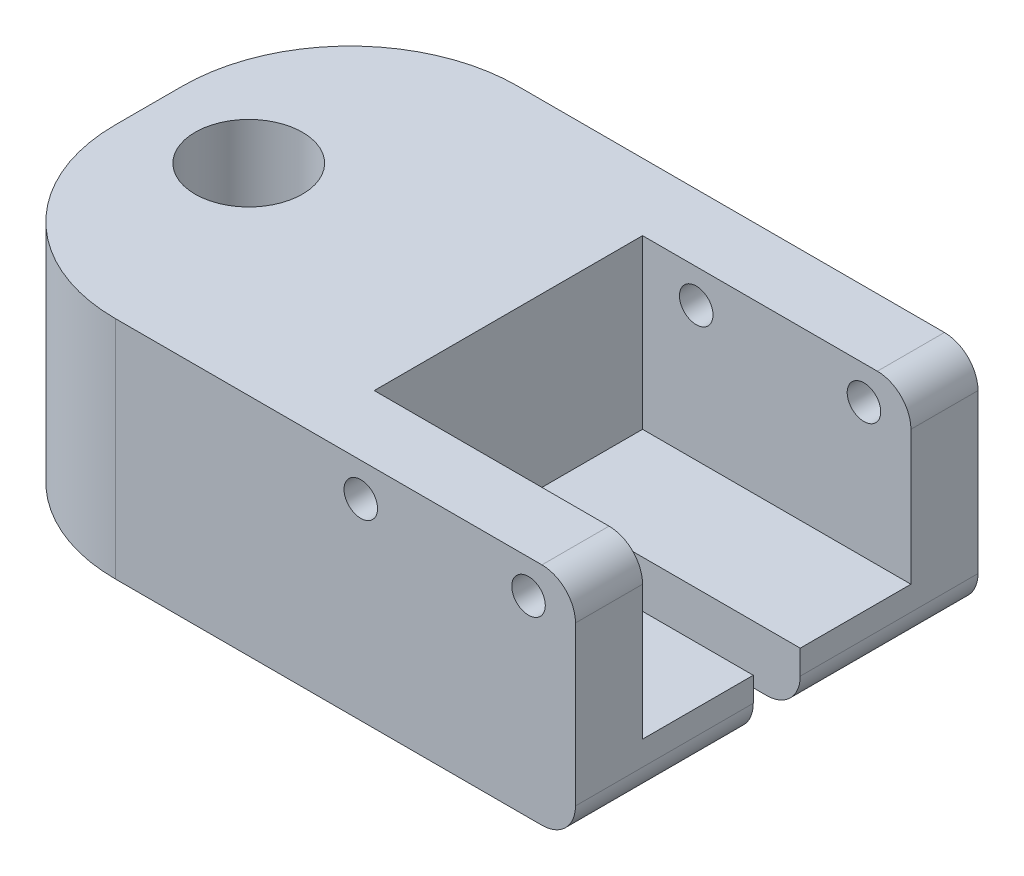
ISO-10303-21;
HEADER;
FILE_DESCRIPTION(('STEP AP214'),'2;1');
FILE_NAME('part.step','',(''),(''),'','','');
FILE_SCHEMA(('AUTOMOTIVE_DESIGN { 1 0 10303 214 1 1 1 1 }'));
ENDSEC;
DATA;
#1=APPLICATION_CONTEXT('core data for automotive mechanical design processes');
#2=APPLICATION_PROTOCOL_DEFINITION('international standard','automotive_design',2000,#1);
#3=PRODUCT_CONTEXT('',#1,'mechanical');
#4=PRODUCT('Part','Part','',(#3));
#5=PRODUCT_RELATED_PRODUCT_CATEGORY('part','',(#4));
#6=PRODUCT_DEFINITION_FORMATION('','',#4);
#7=PRODUCT_DEFINITION_CONTEXT('part definition',#1,'design');
#8=PRODUCT_DEFINITION('design','',#6,#7);
#9=PRODUCT_DEFINITION_SHAPE('','',#8);
#10=(LENGTH_UNIT() NAMED_UNIT(*) SI_UNIT(.MILLI.,.METRE.));
#11=(NAMED_UNIT(*) PLANE_ANGLE_UNIT() SI_UNIT($,.RADIAN.));
#12=(NAMED_UNIT(*) SI_UNIT($,.STERADIAN.) SOLID_ANGLE_UNIT());
#13=UNCERTAINTY_MEASURE_WITH_UNIT(LENGTH_MEASURE(1.E-05),#10,'distance_accuracy_value','');
#14=(GEOMETRIC_REPRESENTATION_CONTEXT(3) GLOBAL_UNCERTAINTY_ASSIGNED_CONTEXT((#13)) GLOBAL_UNIT_ASSIGNED_CONTEXT((#10,
#11,#12)) REPRESENTATION_CONTEXT('',''));
#15=CARTESIAN_POINT('',(0.,0.,0.));
#16=DIRECTION('',(0.,0.,1.));
#17=DIRECTION('',(1.,0.,0.));
#18=AXIS2_PLACEMENT_3D('',#15,#16,#17);
#19=CARTESIAN_POINT('',(79.3704400526235,0.,60.));
#20=DIRECTION('',(-1.,0.,0.));
#21=DIRECTION('',(0.,0.,1.));
#22=AXIS2_PLACEMENT_3D('',#19,#20,#21);
#23=PLANE('',#22);
#24=DIRECTION('',(0.,0.,-1.));
#25=VECTOR('',#24,1.);
#26=CARTESIAN_POINT('',(79.3704400526235,5.,60.));
#27=LINE('',#26,#25);
#28=CARTESIAN_POINT('',(79.3704400526235,5.,60.));
#29=VERTEX_POINT('',#28);
#30=CARTESIAN_POINT('',(79.3704400526235,5.,33.5));
#31=VERTEX_POINT('',#30);
#32=EDGE_CURVE('E281',#29,#31,#27,.T.);
#33=ORIENTED_EDGE('',*,*,#32,.T.);
#34=DIRECTION('',(0.,1.,0.));
#35=VECTOR('',#34,1.);
#36=CARTESIAN_POINT('',(79.3704400526235,0.,33.5));
#37=LINE('',#36,#35);
#38=CARTESIAN_POINT('',(79.3704400526235,8.62000000000002,33.5));
#39=VERTEX_POINT('',#38);
#40=EDGE_CURVE('E195',#31,#39,#37,.T.);
#41=ORIENTED_EDGE('',*,*,#40,.T.);
#42=DIRECTION('',(0.,0.,-1.));
#43=VECTOR('',#42,1.);
#44=CARTESIAN_POINT('',(79.3704400526235,8.62000000000002,30.));
#45=LINE('',#44,#43);
#46=CARTESIAN_POINT('',(79.3704400526235,8.62000000000002,50.));
#47=VERTEX_POINT('',#46);
#48=EDGE_CURVE('E221',#47,#39,#45,.T.);
#49=ORIENTED_EDGE('',*,*,#48,.F.);
#50=DIRECTION('',(0.,-1.,0.));
#51=VECTOR('',#50,1.);
#52=CARTESIAN_POINT('',(79.3704400526235,8.62000000000002,50.));
#53=LINE('',#52,#51);
#54=CARTESIAN_POINT('',(79.3704400526235,28.62,50.));
#55=VERTEX_POINT('',#54);
#56=EDGE_CURVE('E206',#55,#47,#53,.T.);
#57=ORIENTED_EDGE('',*,*,#56,.F.);
#58=DIRECTION('',(0.,0.,-1.));
#59=VECTOR('',#58,1.);
#60=CARTESIAN_POINT('',(79.3704400526235,28.62,60.));
#61=LINE('',#60,#59);
#62=CARTESIAN_POINT('',(79.3704400526235,28.62,60.));
#63=VERTEX_POINT('',#62);
#64=EDGE_CURVE('E276',#55,#63,#61,.F.);
#65=ORIENTED_EDGE('',*,*,#64,.T.);
#66=DIRECTION('',(0.,1.,0.));
#67=VECTOR('',#66,1.);
#68=CARTESIAN_POINT('',(79.3704400526235,0.,60.));
#69=LINE('',#68,#67);
#70=EDGE_CURVE('E239',#29,#63,#69,.T.);
#71=ORIENTED_EDGE('',*,*,#70,.F.);
#72=EDGE_LOOP('',(#33,#41,#49,#57,#65,#71));
#73=FACE_BOUND('',#72,.T.);
#74=ADVANCED_FACE('F36',(#73),#23,.F.);
#75=CARTESIAN_POINT('',(39.3704400526235,8.62000000000002,30.));
#76=DIRECTION('',(0.,-1.,0.));
#77=DIRECTION('',(0.,0.,-1.));
#78=AXIS2_PLACEMENT_3D('',#75,#76,#77);
#79=PLANE('',#78);
#80=ORIENTED_EDGE('',*,*,#48,.T.);
#81=DIRECTION('',(1.,0.,0.));
#82=VECTOR('',#81,1.);
#83=CARTESIAN_POINT('',(79.3704400526235,8.62000000000002,33.5));
#84=LINE('',#83,#82);
#85=CARTESIAN_POINT('',(39.3704400526235,8.62000000000002,33.5));
#86=VERTEX_POINT('',#85);
#87=EDGE_CURVE('E186',#86,#39,#84,.T.);
#88=ORIENTED_EDGE('',*,*,#87,.F.);
#89=DIRECTION('',(0.,0.,-1.));
#90=VECTOR('',#89,1.);
#91=CARTESIAN_POINT('',(39.3704400526235,8.62000000000002,30.));
#92=LINE('',#91,#90);
#93=CARTESIAN_POINT('',(39.3704400526235,8.62000000000002,50.));
#94=VERTEX_POINT('',#93);
#95=EDGE_CURVE('E214',#94,#86,#92,.T.);
#96=ORIENTED_EDGE('',*,*,#95,.F.);
#97=DIRECTION('',(1.,0.,0.));
#98=VECTOR('',#97,1.);
#99=CARTESIAN_POINT('',(39.3704400526235,8.62000000000002,50.));
#100=LINE('',#99,#98);
#101=EDGE_CURVE('E231',#94,#47,#100,.T.);
#102=ORIENTED_EDGE('',*,*,#101,.T.);
#103=EDGE_LOOP('',(#80,#88,#96,#102));
#104=FACE_BOUND('',#103,.T.);
#105=ADVANCED_FACE('F353',(#104),#79,.F.);
#106=CARTESIAN_POINT('',(74.3704400526235,5.,60.));
#107=DIRECTION('',(0.,0.,-1.));
#108=DIRECTION('',(-1.,0.,0.));
#109=AXIS2_PLACEMENT_3D('',#106,#107,#108);
#110=CYLINDRICAL_SURFACE('',#109,5.);
#111=CARTESIAN_POINT('',(74.3704400526235,5.,33.5));
#112=DIRECTION('',(0.,0.,1.));
#113=DIRECTION('',(1.,0.,0.));
#114=AXIS2_PLACEMENT_3D('',#111,#112,#113);
#115=CIRCLE('',#114,5.);
#116=CARTESIAN_POINT('',(74.3704400526235,0.,33.5));
#117=VERTEX_POINT('',#116);
#118=EDGE_CURVE('E11',#31,#117,#115,.F.);
#119=ORIENTED_EDGE('',*,*,#118,.F.);
#120=ORIENTED_EDGE('',*,*,#32,.F.);
#121=CARTESIAN_POINT('',(74.3704400526235,5.,60.));
#122=DIRECTION('',(0.,0.,1.));
#123=DIRECTION('',(1.,0.,0.));
#124=AXIS2_PLACEMENT_3D('',#121,#122,#123);
#125=CIRCLE('',#124,5.);
#126=CARTESIAN_POINT('',(74.3704400526235,0.,60.));
#127=VERTEX_POINT('',#126);
#128=EDGE_CURVE('E292',#127,#29,#125,.T.);
#129=ORIENTED_EDGE('',*,*,#128,.F.);
#130=DIRECTION('',(0.,0.,-1.));
#131=VECTOR('',#130,1.);
#132=CARTESIAN_POINT('',(74.3704400526235,0.,60.));
#133=LINE('',#132,#131);
#134=EDGE_CURVE('E288',#117,#127,#133,.F.);
#135=ORIENTED_EDGE('',*,*,#134,.F.);
#136=EDGE_LOOP('',(#119,#120,#129,#135));
#137=FACE_BOUND('',#136,.T.);
#138=ADVANCED_FACE('F379',(#137),#110,.T.);
#139=CARTESIAN_POINT('',(-14.2295599473765,0.,60.));
#140=DIRECTION('',(0.,1.,0.));
#141=DIRECTION('',(0.,0.,1.));
#142=AXIS2_PLACEMENT_3D('',#139,#140,#141);
#143=PLANE('',#142);
#144=CARTESIAN_POINT('',(0.670440052623487,0.,30.));
#145=DIRECTION('',(0.,1.,0.));
#146=DIRECTION('',(0.,0.,1.));
#147=AXIS2_PLACEMENT_3D('',#144,#145,#146);
#148=CIRCLE('',#147,7.99999999999999);
#149=CARTESIAN_POINT('',(0.670440052623487,0.,38.));
#150=VERTEX_POINT('',#149);
#151=EDGE_CURVE('E203',#150,#150,#148,.T.);
#152=ORIENTED_EDGE('',*,*,#151,.T.);
#153=EDGE_LOOP('',(#152));
#154=FACE_BOUND('',#153,.T.);
#155=DIRECTION('',(0.,0.,1.));
#156=VECTOR('',#155,1.);
#157=CARTESIAN_POINT('',(39.3704400526235,0.,33.5));
#158=LINE('',#157,#156);
#159=CARTESIAN_POINT('',(39.3704400526235,0.,26.5));
#160=VERTEX_POINT('',#159);
#161=CARTESIAN_POINT('',(39.3704400526235,0.,33.5));
#162=VERTEX_POINT('',#161);
#163=EDGE_CURVE('E172',#160,#162,#158,.T.);
#164=ORIENTED_EDGE('',*,*,#163,.T.);
#165=DIRECTION('',(1.,0.,0.));
#166=VECTOR('',#165,1.);
#167=CARTESIAN_POINT('',(79.3704400526235,0.,33.5));
#168=LINE('',#167,#166);
#169=EDGE_CURVE('E179',#162,#117,#168,.T.);
#170=ORIENTED_EDGE('',*,*,#169,.T.);
#171=ORIENTED_EDGE('',*,*,#134,.T.);
#172=DIRECTION('',(1.,0.,0.));
#173=VECTOR('',#172,1.);
#174=CARTESIAN_POINT('',(-14.2295599473765,0.,60.));
#175=LINE('',#174,#173);
#176=CARTESIAN_POINT('',(10.7704400526235,0.,60.));
#177=VERTEX_POINT('',#176);
#178=EDGE_CURVE('E236',#177,#127,#175,.T.);
#179=ORIENTED_EDGE('',*,*,#178,.F.);
#180=CARTESIAN_POINT('',(10.7704400526235,0.,35.));
#181=DIRECTION('',(0.,1.,0.));
#182=DIRECTION('',(0.,0.,1.));
#183=AXIS2_PLACEMENT_3D('',#180,#181,#182);
#184=CIRCLE('',#183,25.);
#185=CARTESIAN_POINT('',(-14.2295599473765,0.,35.));
#186=VERTEX_POINT('',#185);
#187=EDGE_CURVE('E261',#177,#186,#184,.F.);
#188=ORIENTED_EDGE('',*,*,#187,.T.);
#189=DIRECTION('',(0.,0.,-1.));
#190=VECTOR('',#189,1.);
#191=CARTESIAN_POINT('',(-14.2295599473765,0.,60.));
#192=LINE('',#191,#190);
#193=CARTESIAN_POINT('',(-14.2295599473765,0.,25.));
#194=VERTEX_POINT('',#193);
#195=EDGE_CURVE('E245',#186,#194,#192,.T.);
#196=ORIENTED_EDGE('',*,*,#195,.T.);
#197=CARTESIAN_POINT('',(10.7704400526235,0.,25.));
#198=DIRECTION('',(0.,1.,0.));
#199=DIRECTION('',(0.,0.,1.));
#200=AXIS2_PLACEMENT_3D('',#197,#198,#199);
#201=CIRCLE('',#200,25.);
#202=CARTESIAN_POINT('',(10.7704400526235,0.,0.));
#203=VERTEX_POINT('',#202);
#204=EDGE_CURVE('E263',#194,#203,#201,.F.);
#205=ORIENTED_EDGE('',*,*,#204,.T.);
#206=DIRECTION('',(1.,0.,0.));
#207=VECTOR('',#206,1.);
#208=CARTESIAN_POINT('',(-14.2295599473765,0.,0.));
#209=LINE('',#208,#207);
#210=CARTESIAN_POINT('',(74.3704400526235,0.,0.));
#211=VERTEX_POINT('',#210);
#212=EDGE_CURVE('E227',#203,#211,#209,.T.);
#213=ORIENTED_EDGE('',*,*,#212,.T.);
#214=CARTESIAN_POINT('',(74.3704400526235,0.,26.5));
#215=VERTEX_POINT('',#214);
#216=EDGE_CURVE('E185',#211,#215,#133,.F.);
#217=ORIENTED_EDGE('',*,*,#216,.T.);
#218=DIRECTION('',(-1.,0.,0.));
#219=VECTOR('',#218,1.);
#220=CARTESIAN_POINT('',(39.3704400526235,0.,26.5));
#221=LINE('',#220,#219);
#222=EDGE_CURVE('E52',#215,#160,#221,.T.);
#223=ORIENTED_EDGE('',*,*,#222,.T.);
#224=EDGE_LOOP('',(#164,#170,#171,#179,#188,#196,#205,#213,#217,#223));
#225=FACE_BOUND('',#224,.T.);
#226=ADVANCED_FACE('F182',(#154,#225),#143,.F.);
#227=CARTESIAN_POINT('',(79.3704400526235,8.62000000000002,26.5));
#228=VERTEX_POINT('',#227);
#229=CARTESIAN_POINT('',(79.3704400526235,8.62000000000002,10.));
#230=VERTEX_POINT('',#229);
#231=EDGE_CURVE('E220',#228,#230,#45,.T.);
#232=ORIENTED_EDGE('',*,*,#231,.F.);
#233=DIRECTION('',(0.,1.,0.));
#234=VECTOR('',#233,1.);
#235=CARTESIAN_POINT('',(79.3704400526235,0.,26.5));
#236=LINE('',#235,#234);
#237=CARTESIAN_POINT('',(79.3704400526235,5.,26.5));
#238=VERTEX_POINT('',#237);
#239=EDGE_CURVE('E169',#238,#228,#236,.T.);
#240=ORIENTED_EDGE('',*,*,#239,.F.);
#241=CARTESIAN_POINT('',(79.3704400526235,5.,0.));
#242=VERTEX_POINT('',#241);
#243=EDGE_CURVE('E280',#238,#242,#27,.T.);
#244=ORIENTED_EDGE('',*,*,#243,.T.);
#245=DIRECTION('',(0.,1.,0.));
#246=VECTOR('',#245,1.);
#247=CARTESIAN_POINT('',(79.3704400526235,0.,0.));
#248=LINE('',#247,#246);
#249=CARTESIAN_POINT('',(79.3704400526235,28.62,0.));
#250=VERTEX_POINT('',#249);
#251=EDGE_CURVE('E247',#242,#250,#248,.T.);
#252=ORIENTED_EDGE('',*,*,#251,.T.);
#253=DIRECTION('',(0.,0.,-1.));
#254=VECTOR('',#253,1.);
#255=CARTESIAN_POINT('',(79.3704400526235,28.62,60.));
#256=LINE('',#255,#254);
#257=CARTESIAN_POINT('',(79.3704400526235,28.62,10.));
#258=VERTEX_POINT('',#257);
#259=EDGE_CURVE('E278',#250,#258,#256,.F.);
#260=ORIENTED_EDGE('',*,*,#259,.T.);
#261=DIRECTION('',(0.,1.,0.));
#262=VECTOR('',#261,1.);
#263=CARTESIAN_POINT('',(79.3704400526235,33.62,10.));
#264=LINE('',#263,#262);
#265=EDGE_CURVE('E210',#230,#258,#264,.T.);
#266=ORIENTED_EDGE('',*,*,#265,.F.);
#267=EDGE_LOOP('',(#232,#240,#244,#252,#260,#266));
#268=FACE_BOUND('',#267,.T.);
#269=ADVANCED_FACE('F308',(#268),#23,.F.);
#270=CARTESIAN_POINT('',(79.3704400526235,33.62,60.));
#271=DIRECTION('',(0.,-1.,0.));
#272=DIRECTION('',(1.,0.,0.));
#273=AXIS2_PLACEMENT_3D('',#270,#271,#272);
#274=PLANE('',#273);
#275=CARTESIAN_POINT('',(0.670440052623487,33.62,30.));
#276=DIRECTION('',(0.,1.,0.));
#277=DIRECTION('',(0.,0.,1.));
#278=AXIS2_PLACEMENT_3D('',#275,#276,#277);
#279=CIRCLE('',#278,8.);
#280=CARTESIAN_POINT('',(0.670440052623487,33.62,38.));
#281=VERTEX_POINT('',#280);
#282=EDGE_CURVE('E198',#281,#281,#279,.T.);
#283=ORIENTED_EDGE('',*,*,#282,.F.);
#284=EDGE_LOOP('',(#283));
#285=FACE_BOUND('',#284,.T.);
#286=DIRECTION('',(1.,0.,0.));
#287=VECTOR('',#286,1.);
#288=CARTESIAN_POINT('',(39.3704400526235,33.62,10.));
#289=LINE('',#288,#287);
#290=CARTESIAN_POINT('',(39.3704400526235,33.62,10.));
#291=VERTEX_POINT('',#290);
#292=CARTESIAN_POINT('',(74.3704400526235,33.62,10.));
#293=VERTEX_POINT('',#292);
#294=EDGE_CURVE('E225',#291,#293,#289,.T.);
#295=ORIENTED_EDGE('',*,*,#294,.T.);
#296=DIRECTION('',(0.,0.,-1.));
#297=VECTOR('',#296,1.);
#298=CARTESIAN_POINT('',(74.3704400526235,33.62,60.));
#299=LINE('',#298,#297);
#300=CARTESIAN_POINT('',(74.3704400526235,33.62,0.));
#301=VERTEX_POINT('',#300);
#302=EDGE_CURVE('E297',#293,#301,#299,.T.);
#303=ORIENTED_EDGE('',*,*,#302,.T.);
#304=DIRECTION('',(-1.,0.,0.));
#305=VECTOR('',#304,1.);
#306=CARTESIAN_POINT('',(79.3704400526235,33.62,0.));
#307=LINE('',#306,#305);
#308=CARTESIAN_POINT('',(10.7704400526235,33.62,0.));
#309=VERTEX_POINT('',#308);
#310=EDGE_CURVE('E240',#301,#309,#307,.T.);
#311=ORIENTED_EDGE('',*,*,#310,.T.);
#312=CARTESIAN_POINT('',(10.7704400526235,33.62,25.));
#313=DIRECTION('',(0.,-1.,0.));
#314=DIRECTION('',(1.,0.,0.));
#315=AXIS2_PLACEMENT_3D('',#312,#313,#314);
#316=CIRCLE('',#315,25.);
#317=CARTESIAN_POINT('',(-14.2295599473765,33.62,25.));
#318=VERTEX_POINT('',#317);
#319=EDGE_CURVE('E271',#309,#318,#316,.F.);
#320=ORIENTED_EDGE('',*,*,#319,.T.);
#321=DIRECTION('',(0.,0.,-1.));
#322=VECTOR('',#321,1.);
#323=CARTESIAN_POINT('',(-14.2295599473765,33.62,60.));
#324=LINE('',#323,#322);
#325=CARTESIAN_POINT('',(-14.2295599473765,33.62,35.));
#326=VERTEX_POINT('',#325);
#327=EDGE_CURVE('E253',#326,#318,#324,.T.);
#328=ORIENTED_EDGE('',*,*,#327,.F.);
#329=CARTESIAN_POINT('',(10.7704400526235,33.62,35.));
#330=DIRECTION('',(0.,-1.,0.));
#331=DIRECTION('',(1.,0.,0.));
#332=AXIS2_PLACEMENT_3D('',#329,#330,#331);
#333=CIRCLE('',#332,25.);
#334=CARTESIAN_POINT('',(10.7704400526235,33.62,60.));
#335=VERTEX_POINT('',#334);
#336=EDGE_CURVE('E268',#326,#335,#333,.F.);
#337=ORIENTED_EDGE('',*,*,#336,.T.);
#338=DIRECTION('',(-1.,0.,0.));
#339=VECTOR('',#338,1.);
#340=CARTESIAN_POINT('',(79.3704400526235,33.62,60.));
#341=LINE('',#340,#339);
#342=CARTESIAN_POINT('',(74.3704400526235,33.62,60.));
#343=VERTEX_POINT('',#342);
#344=EDGE_CURVE('E243',#343,#335,#341,.T.);
#345=ORIENTED_EDGE('',*,*,#344,.F.);
#346=DIRECTION('',(0.,0.,-1.));
#347=VECTOR('',#346,1.);
#348=CARTESIAN_POINT('',(74.3704400526235,33.62,60.));
#349=LINE('',#348,#347);
#350=CARTESIAN_POINT('',(74.3704400526235,33.62,50.));
#351=VERTEX_POINT('',#350);
#352=EDGE_CURVE('E294',#343,#351,#349,.T.);
#353=ORIENTED_EDGE('',*,*,#352,.T.);
#354=DIRECTION('',(1.,0.,0.));
#355=VECTOR('',#354,1.);
#356=CARTESIAN_POINT('',(39.3704400526235,33.62,50.));
#357=LINE('',#356,#355);
#358=CARTESIAN_POINT('',(39.3704400526235,33.62,50.));
#359=VERTEX_POINT('',#358);
#360=EDGE_CURVE('E218',#359,#351,#357,.T.);
#361=ORIENTED_EDGE('',*,*,#360,.F.);
#362=DIRECTION('',(0.,0.,1.));
#363=VECTOR('',#362,1.);
#364=CARTESIAN_POINT('',(39.3704400526235,33.62,50.));
#365=LINE('',#364,#363);
#366=EDGE_CURVE('E207',#291,#359,#365,.T.);
#367=ORIENTED_EDGE('',*,*,#366,.F.);
#368=EDGE_LOOP('',(#295,#303,#311,#320,#328,#337,#345,#353,#361,#367));
#369=FACE_BOUND('',#368,.T.);
#370=ADVANCED_FACE('F322',(#285,#369),#274,.F.);
#371=CARTESIAN_POINT('',(-14.2295599473765,33.62,60.));
#372=DIRECTION('',(1.,0.,0.));
#373=DIRECTION('',(0.,1.,0.));
#374=AXIS2_PLACEMENT_3D('',#371,#372,#373);
#375=PLANE('',#374);
#376=ORIENTED_EDGE('',*,*,#327,.T.);
#377=DIRECTION('',(0.,-1.,0.));
#378=VECTOR('',#377,1.);
#379=CARTESIAN_POINT('',(-14.2295599473765,33.62,25.));
#380=LINE('',#379,#378);
#381=EDGE_CURVE('E258',#318,#194,#380,.T.);
#382=ORIENTED_EDGE('',*,*,#381,.T.);
#383=ORIENTED_EDGE('',*,*,#195,.F.);
#384=DIRECTION('',(0.,-1.,0.));
#385=VECTOR('',#384,1.);
#386=CARTESIAN_POINT('',(-14.2295599473765,33.62,35.));
#387=LINE('',#386,#385);
#388=EDGE_CURVE('E256',#186,#326,#387,.F.);
#389=ORIENTED_EDGE('',*,*,#388,.T.);
#390=EDGE_LOOP('',(#376,#382,#383,#389));
#391=FACE_BOUND('',#390,.T.);
#392=ADVANCED_FACE('F332',(#391),#375,.F.);
#393=CARTESIAN_POINT('',(0.,0.,60.));
#394=DIRECTION('',(0.,0.,1.));
#395=DIRECTION('',(1.,0.,0.));
#396=AXIS2_PLACEMENT_3D('',#393,#394,#395);
#397=PLANE('',#396);
#398=CARTESIAN_POINT('',(72.3704400526235,28.62,60.));
#399=DIRECTION('',(0.,0.,1.));
#400=DIRECTION('',(1.,0.,0.));
#401=AXIS2_PLACEMENT_3D('',#398,#399,#400);
#402=CIRCLE('',#401,2.49999999999999);
#403=CARTESIAN_POINT('',(74.8704400526235,28.62,60.));
#404=VERTEX_POINT('',#403);
#405=EDGE_CURVE('E503',#404,#404,#402,.T.);
#406=ORIENTED_EDGE('',*,*,#405,.F.);
#407=EDGE_LOOP('',(#406));
#408=FACE_BOUND('',#407,.T.);
#409=CARTESIAN_POINT('',(47.3704400526235,28.62,60.));
#410=DIRECTION('',(0.,0.,1.));
#411=DIRECTION('',(1.,0.,0.));
#412=AXIS2_PLACEMENT_3D('',#409,#410,#411);
#413=CIRCLE('',#412,2.49999999999999);
#414=CARTESIAN_POINT('',(49.8704400526235,28.62,60.));
#415=VERTEX_POINT('',#414);
#416=EDGE_CURVE('E506',#415,#415,#413,.T.);
#417=ORIENTED_EDGE('',*,*,#416,.F.);
#418=EDGE_LOOP('',(#417));
#419=FACE_BOUND('',#418,.T.);
#420=ORIENTED_EDGE('',*,*,#178,.T.);
#421=ORIENTED_EDGE('',*,*,#128,.T.);
#422=ORIENTED_EDGE('',*,*,#70,.T.);
#423=CARTESIAN_POINT('',(74.3704400526235,28.62,60.));
#424=DIRECTION('',(0.,0.,1.));
#425=DIRECTION('',(1.,0.,0.));
#426=AXIS2_PLACEMENT_3D('',#423,#424,#425);
#427=CIRCLE('',#426,5.);
#428=EDGE_CURVE('E290',#63,#343,#427,.T.);
#429=ORIENTED_EDGE('',*,*,#428,.T.);
#430=ORIENTED_EDGE('',*,*,#344,.T.);
#431=DIRECTION('',(0.,-1.,0.));
#432=VECTOR('',#431,1.);
#433=CARTESIAN_POINT('',(10.7704400526235,0.,60.));
#434=LINE('',#433,#432);
#435=EDGE_CURVE('E273',#335,#177,#434,.T.);
#436=ORIENTED_EDGE('',*,*,#435,.T.);
#437=EDGE_LOOP('',(#420,#421,#422,#429,#430,#436));
#438=FACE_BOUND('',#437,.T.);
#439=ADVANCED_FACE('F368',(#408,#419,#438),#397,.T.);
#440=CARTESIAN_POINT('',(0.,0.,0.));
#441=DIRECTION('',(0.,0.,1.));
#442=DIRECTION('',(1.,0.,0.));
#443=AXIS2_PLACEMENT_3D('',#440,#441,#442);
#444=PLANE('',#443);
#445=CARTESIAN_POINT('',(72.3704400526235,28.62,0.));
#446=DIRECTION('',(0.,0.,1.));
#447=DIRECTION('',(1.,0.,0.));
#448=AXIS2_PLACEMENT_3D('',#445,#446,#447);
#449=CIRCLE('',#448,2.49999999999999);
#450=CARTESIAN_POINT('',(74.8704400526235,28.62,0.));
#451=VERTEX_POINT('',#450);
#452=EDGE_CURVE('E511',#451,#451,#449,.T.);
#453=ORIENTED_EDGE('',*,*,#452,.T.);
#454=EDGE_LOOP('',(#453));
#455=FACE_BOUND('',#454,.T.);
#456=CARTESIAN_POINT('',(47.3704400526235,28.62,0.));
#457=DIRECTION('',(0.,0.,1.));
#458=DIRECTION('',(1.,0.,0.));
#459=AXIS2_PLACEMENT_3D('',#456,#457,#458);
#460=CIRCLE('',#459,2.49999999999999);
#461=CARTESIAN_POINT('',(49.8704400526235,28.62,0.));
#462=VERTEX_POINT('',#461);
#463=EDGE_CURVE('E509',#462,#462,#460,.T.);
#464=ORIENTED_EDGE('',*,*,#463,.T.);
#465=EDGE_LOOP('',(#464));
#466=FACE_BOUND('',#465,.T.);
#467=ORIENTED_EDGE('',*,*,#251,.F.);
#468=CARTESIAN_POINT('',(74.3704400526235,5.,0.));
#469=DIRECTION('',(0.,0.,1.));
#470=DIRECTION('',(1.,0.,0.));
#471=AXIS2_PLACEMENT_3D('',#468,#469,#470);
#472=CIRCLE('',#471,5.);
#473=EDGE_CURVE('E286',#242,#211,#472,.F.);
#474=ORIENTED_EDGE('',*,*,#473,.T.);
#475=ORIENTED_EDGE('',*,*,#212,.F.);
#476=DIRECTION('',(0.,-1.,0.));
#477=VECTOR('',#476,1.);
#478=CARTESIAN_POINT('',(10.7704400526235,0.,0.));
#479=LINE('',#478,#477);
#480=EDGE_CURVE('E265',#203,#309,#479,.F.);
#481=ORIENTED_EDGE('',*,*,#480,.T.);
#482=ORIENTED_EDGE('',*,*,#310,.F.);
#483=CARTESIAN_POINT('',(74.3704400526235,28.62,0.));
#484=DIRECTION('',(0.,0.,1.));
#485=DIRECTION('',(1.,0.,0.));
#486=AXIS2_PLACEMENT_3D('',#483,#484,#485);
#487=CIRCLE('',#486,5.);
#488=EDGE_CURVE('E284',#301,#250,#487,.F.);
#489=ORIENTED_EDGE('',*,*,#488,.T.);
#490=EDGE_LOOP('',(#467,#474,#475,#481,#482,#489));
#491=FACE_BOUND('',#490,.T.);
#492=ADVANCED_FACE('F315',(#455,#466,#491),#444,.F.);
#493=CARTESIAN_POINT('',(39.3704400526235,33.62,10.));
#494=DIRECTION('',(0.,0.,-1.));
#495=DIRECTION('',(0.,1.,0.));
#496=AXIS2_PLACEMENT_3D('',#493,#494,#495);
#497=PLANE('',#496);
#498=CARTESIAN_POINT('',(72.3704400526235,28.62,10.));
#499=DIRECTION('',(0.,0.,-1.));
#500=DIRECTION('',(0.,1.,0.));
#501=AXIS2_PLACEMENT_3D('',#498,#499,#500);
#502=CIRCLE('',#501,2.49999999999999);
#503=CARTESIAN_POINT('',(72.3704400526235,31.12,10.));
#504=VERTEX_POINT('',#503);
#505=EDGE_CURVE('E40',#504,#504,#502,.T.);
#506=ORIENTED_EDGE('',*,*,#505,.T.);
#507=EDGE_LOOP('',(#506));
#508=FACE_BOUND('',#507,.T.);
#509=CARTESIAN_POINT('',(47.3704400526235,28.62,10.));
#510=DIRECTION('',(0.,0.,-1.));
#511=DIRECTION('',(0.,1.,0.));
#512=AXIS2_PLACEMENT_3D('',#509,#510,#511);
#513=CIRCLE('',#512,2.49999999999999);
#514=CARTESIAN_POINT('',(47.3704400526235,31.12,10.));
#515=VERTEX_POINT('',#514);
#516=EDGE_CURVE('E190',#515,#515,#513,.T.);
#517=ORIENTED_EDGE('',*,*,#516,.T.);
#518=EDGE_LOOP('',(#517));
#519=FACE_BOUND('',#518,.T.);
#520=ORIENTED_EDGE('',*,*,#265,.T.);
#521=CARTESIAN_POINT('',(74.3704400526235,28.62,10.));
#522=DIRECTION('',(0.,0.,-1.));
#523=DIRECTION('',(0.,1.,0.));
#524=AXIS2_PLACEMENT_3D('',#521,#522,#523);
#525=CIRCLE('',#524,5.);
#526=EDGE_CURVE('E60',#258,#293,#525,.F.);
#527=ORIENTED_EDGE('',*,*,#526,.T.);
#528=ORIENTED_EDGE('',*,*,#294,.F.);
#529=DIRECTION('',(0.,1.,0.));
#530=VECTOR('',#529,1.);
#531=CARTESIAN_POINT('',(39.3704400526235,33.62,10.));
#532=LINE('',#531,#530);
#533=CARTESIAN_POINT('',(39.3704400526235,8.62000000000002,10.));
#534=VERTEX_POINT('',#533);
#535=EDGE_CURVE('E216',#534,#291,#532,.T.);
#536=ORIENTED_EDGE('',*,*,#535,.F.);
#537=DIRECTION('',(1.,0.,0.));
#538=VECTOR('',#537,1.);
#539=CARTESIAN_POINT('',(39.3704400526235,8.62000000000002,10.));
#540=LINE('',#539,#538);
#541=EDGE_CURVE('E228',#534,#230,#540,.T.);
#542=ORIENTED_EDGE('',*,*,#541,.T.);
#543=EDGE_LOOP('',(#520,#527,#528,#536,#542));
#544=FACE_BOUND('',#543,.T.);
#545=ADVANCED_FACE('F357',(#508,#519,#544),#497,.F.);
#546=CARTESIAN_POINT('',(39.3704400526235,8.62000000000002,26.5));
#547=VERTEX_POINT('',#546);
#548=EDGE_CURVE('E213',#547,#534,#92,.T.);
#549=ORIENTED_EDGE('',*,*,#548,.F.);
#550=DIRECTION('',(-1.,0.,0.));
#551=VECTOR('',#550,1.);
#552=CARTESIAN_POINT('',(39.3704400526235,8.62000000000002,26.5));
#553=LINE('',#552,#551);
#554=EDGE_CURVE('E165',#228,#547,#553,.T.);
#555=ORIENTED_EDGE('',*,*,#554,.F.);
#556=ORIENTED_EDGE('',*,*,#231,.T.);
#557=ORIENTED_EDGE('',*,*,#541,.F.);
#558=EDGE_LOOP('',(#549,#555,#556,#557));
#559=FACE_BOUND('',#558,.T.);
#560=ADVANCED_FACE('F359',(#559),#79,.F.);
#561=CARTESIAN_POINT('',(39.3704400526235,8.62000000000002,50.));
#562=DIRECTION('',(0.,0.,1.));
#563=DIRECTION('',(1.,0.,0.));
#564=AXIS2_PLACEMENT_3D('',#561,#562,#563);
#565=PLANE('',#564);
#566=CARTESIAN_POINT('',(72.3704400526235,28.62,50.));
#567=DIRECTION('',(0.,0.,1.));
#568=DIRECTION('',(1.,0.,0.));
#569=AXIS2_PLACEMENT_3D('',#566,#567,#568);
#570=CIRCLE('',#569,2.49999999999999);
#571=CARTESIAN_POINT('',(74.8704400526235,28.62,50.));
#572=VERTEX_POINT('',#571);
#573=EDGE_CURVE('E505',#572,#572,#570,.T.);
#574=ORIENTED_EDGE('',*,*,#573,.T.);
#575=EDGE_LOOP('',(#574));
#576=FACE_BOUND('',#575,.T.);
#577=CARTESIAN_POINT('',(47.3704400526235,28.62,50.));
#578=DIRECTION('',(0.,0.,1.));
#579=DIRECTION('',(1.,0.,0.));
#580=AXIS2_PLACEMENT_3D('',#577,#578,#579);
#581=CIRCLE('',#580,2.49999999999999);
#582=CARTESIAN_POINT('',(49.8704400526235,28.62,50.));
#583=VERTEX_POINT('',#582);
#584=EDGE_CURVE('E516',#583,#583,#581,.T.);
#585=ORIENTED_EDGE('',*,*,#584,.T.);
#586=EDGE_LOOP('',(#585));
#587=FACE_BOUND('',#586,.T.);
#588=ORIENTED_EDGE('',*,*,#360,.T.);
#589=CARTESIAN_POINT('',(74.3704400526235,28.62,50.));
#590=DIRECTION('',(0.,0.,1.));
#591=DIRECTION('',(1.,0.,0.));
#592=AXIS2_PLACEMENT_3D('',#589,#590,#591);
#593=CIRCLE('',#592,5.);
#594=EDGE_CURVE('E301',#351,#55,#593,.F.);
#595=ORIENTED_EDGE('',*,*,#594,.T.);
#596=ORIENTED_EDGE('',*,*,#56,.T.);
#597=ORIENTED_EDGE('',*,*,#101,.F.);
#598=DIRECTION('',(0.,-1.,0.));
#599=VECTOR('',#598,1.);
#600=CARTESIAN_POINT('',(39.3704400526235,8.62000000000002,50.));
#601=LINE('',#600,#599);
#602=EDGE_CURVE('E209',#359,#94,#601,.T.);
#603=ORIENTED_EDGE('',*,*,#602,.F.);
#604=EDGE_LOOP('',(#588,#595,#596,#597,#603));
#605=FACE_BOUND('',#604,.T.);
#606=ADVANCED_FACE('F347',(#576,#587,#605),#565,.F.);
#607=CARTESIAN_POINT('',(39.3704400526235,0.,0.));
#608=DIRECTION('',(-1.,0.,0.));
#609=DIRECTION('',(0.,0.,1.));
#610=AXIS2_PLACEMENT_3D('',#607,#608,#609);
#611=PLANE('',#610);
#612=ORIENTED_EDGE('',*,*,#366,.T.);
#613=ORIENTED_EDGE('',*,*,#602,.T.);
#614=ORIENTED_EDGE('',*,*,#95,.T.);
#615=DIRECTION('',(0.,1.,0.));
#616=VECTOR('',#615,1.);
#617=CARTESIAN_POINT('',(39.3704400526235,0.,33.5));
#618=LINE('',#617,#616);
#619=EDGE_CURVE('E168',#162,#86,#618,.T.);
#620=ORIENTED_EDGE('',*,*,#619,.F.);
#621=ORIENTED_EDGE('',*,*,#163,.F.);
#622=DIRECTION('',(0.,1.,0.));
#623=VECTOR('',#622,1.);
#624=CARTESIAN_POINT('',(39.3704400526235,0.,26.5));
#625=LINE('',#624,#623);
#626=EDGE_CURVE('E161',#160,#547,#625,.T.);
#627=ORIENTED_EDGE('',*,*,#626,.T.);
#628=ORIENTED_EDGE('',*,*,#548,.T.);
#629=ORIENTED_EDGE('',*,*,#535,.T.);
#630=EDGE_LOOP('',(#612,#613,#614,#620,#621,#627,#628,#629));
#631=FACE_BOUND('',#630,.T.);
#632=ADVANCED_FACE('F174',(#631),#611,.F.);
#633=CARTESIAN_POINT('',(10.7704400526235,33.62,25.));
#634=DIRECTION('',(0.,-1.,0.));
#635=DIRECTION('',(1.,0.,0.));
#636=AXIS2_PLACEMENT_3D('',#633,#634,#635);
#637=CYLINDRICAL_SURFACE('',#636,25.);
#638=ORIENTED_EDGE('',*,*,#319,.F.);
#639=ORIENTED_EDGE('',*,*,#480,.F.);
#640=ORIENTED_EDGE('',*,*,#204,.F.);
#641=ORIENTED_EDGE('',*,*,#381,.F.);
#642=EDGE_LOOP('',(#638,#639,#640,#641));
#643=FACE_BOUND('',#642,.T.);
#644=ADVANCED_FACE('F328',(#643),#637,.T.);
#645=CARTESIAN_POINT('',(10.7704400526235,0.,35.));
#646=DIRECTION('',(0.,1.,0.));
#647=DIRECTION('',(-1.,0.,0.));
#648=AXIS2_PLACEMENT_3D('',#645,#646,#647);
#649=CYLINDRICAL_SURFACE('',#648,25.);
#650=ORIENTED_EDGE('',*,*,#336,.F.);
#651=ORIENTED_EDGE('',*,*,#388,.F.);
#652=ORIENTED_EDGE('',*,*,#187,.F.);
#653=ORIENTED_EDGE('',*,*,#435,.F.);
#654=EDGE_LOOP('',(#650,#651,#652,#653));
#655=FACE_BOUND('',#654,.T.);
#656=ADVANCED_FACE('F336',(#655),#649,.T.);
#657=CARTESIAN_POINT('',(0.670440052623487,33.62,30.));
#658=DIRECTION('',(0.,1.,0.));
#659=DIRECTION('',(0.,0.,1.));
#660=AXIS2_PLACEMENT_3D('',#657,#658,#659);
#661=CYLINDRICAL_SURFACE('',#660,8.);
#662=ORIENTED_EDGE('',*,*,#151,.F.);
#663=EDGE_LOOP('',(#662));
#664=FACE_BOUND('',#663,.T.);
#665=ORIENTED_EDGE('',*,*,#282,.T.);
#666=EDGE_LOOP('',(#665));
#667=FACE_BOUND('',#666,.T.);
#668=ADVANCED_FACE('F398',(#664,#667),#661,.F.);
#669=CARTESIAN_POINT('',(74.3704400526235,5.,26.5));
#670=DIRECTION('',(0.,0.,-1.));
#671=DIRECTION('',(-1.,0.,0.));
#672=AXIS2_PLACEMENT_3D('',#669,#670,#671);
#673=CIRCLE('',#672,5.);
#674=EDGE_CURVE('E45',#215,#238,#673,.F.);
#675=ORIENTED_EDGE('',*,*,#674,.F.);
#676=ORIENTED_EDGE('',*,*,#216,.F.);
#677=ORIENTED_EDGE('',*,*,#473,.F.);
#678=ORIENTED_EDGE('',*,*,#243,.F.);
#679=EDGE_LOOP('',(#675,#676,#677,#678));
#680=FACE_BOUND('',#679,.T.);
#681=ADVANCED_FACE('F311',(#680),#110,.T.);
#682=CARTESIAN_POINT('',(74.3704400526235,28.62,60.));
#683=DIRECTION('',(0.,0.,-1.));
#684=DIRECTION('',(-1.,0.,0.));
#685=AXIS2_PLACEMENT_3D('',#682,#683,#684);
#686=CYLINDRICAL_SURFACE('',#685,5.);
#687=ORIENTED_EDGE('',*,*,#526,.F.);
#688=ORIENTED_EDGE('',*,*,#259,.F.);
#689=ORIENTED_EDGE('',*,*,#488,.F.);
#690=ORIENTED_EDGE('',*,*,#302,.F.);
#691=EDGE_LOOP('',(#687,#688,#689,#690));
#692=FACE_BOUND('',#691,.T.);
#693=ADVANCED_FACE('F319',(#692),#686,.T.);
#694=CARTESIAN_POINT('',(74.3704400526235,28.62,60.));
#695=DIRECTION('',(0.,0.,-1.));
#696=DIRECTION('',(-1.,0.,0.));
#697=AXIS2_PLACEMENT_3D('',#694,#695,#696);
#698=CYLINDRICAL_SURFACE('',#697,5.);
#699=ORIENTED_EDGE('',*,*,#428,.F.);
#700=ORIENTED_EDGE('',*,*,#64,.F.);
#701=ORIENTED_EDGE('',*,*,#594,.F.);
#702=ORIENTED_EDGE('',*,*,#352,.F.);
#703=EDGE_LOOP('',(#699,#700,#701,#702));
#704=FACE_BOUND('',#703,.T.);
#705=ADVANCED_FACE('F38',(#704),#698,.T.);
#706=CARTESIAN_POINT('',(79.3704400526235,0.,33.5));
#707=DIRECTION('',(0.,0.,1.));
#708=DIRECTION('',(1.,0.,0.));
#709=AXIS2_PLACEMENT_3D('',#706,#707,#708);
#710=PLANE('',#709);
#711=ORIENTED_EDGE('',*,*,#118,.T.);
#712=ORIENTED_EDGE('',*,*,#169,.F.);
#713=ORIENTED_EDGE('',*,*,#619,.T.);
#714=ORIENTED_EDGE('',*,*,#87,.T.);
#715=ORIENTED_EDGE('',*,*,#40,.F.);
#716=EDGE_LOOP('',(#711,#712,#713,#714,#715));
#717=FACE_BOUND('',#716,.T.);
#718=ADVANCED_FACE('F404',(#717),#710,.F.);
#719=CARTESIAN_POINT('',(39.3704400526235,0.,26.5));
#720=DIRECTION('',(0.,0.,-1.));
#721=DIRECTION('',(-1.,0.,0.));
#722=AXIS2_PLACEMENT_3D('',#719,#720,#721);
#723=PLANE('',#722);
#724=ORIENTED_EDGE('',*,*,#674,.T.);
#725=ORIENTED_EDGE('',*,*,#239,.T.);
#726=ORIENTED_EDGE('',*,*,#554,.T.);
#727=ORIENTED_EDGE('',*,*,#626,.F.);
#728=ORIENTED_EDGE('',*,*,#222,.F.);
#729=EDGE_LOOP('',(#724,#725,#726,#727,#728));
#730=FACE_BOUND('',#729,.T.);
#731=ADVANCED_FACE('F163',(#730),#723,.F.);
#732=CARTESIAN_POINT('',(47.3704400526235,28.62,60.));
#733=DIRECTION('',(0.,0.,1.));
#734=DIRECTION('',(1.,0.,0.));
#735=AXIS2_PLACEMENT_3D('',#732,#733,#734);
#736=CYLINDRICAL_SURFACE('',#735,2.49999999999999);
#737=ORIENTED_EDGE('',*,*,#463,.F.);
#738=EDGE_LOOP('',(#737));
#739=FACE_BOUND('',#738,.T.);
#740=ORIENTED_EDGE('',*,*,#516,.F.);
#741=EDGE_LOOP('',(#740));
#742=FACE_BOUND('',#741,.T.);
#743=ADVANCED_FACE('F413',(#739,#742),#736,.F.);
#744=ORIENTED_EDGE('',*,*,#416,.T.);
#745=EDGE_LOOP('',(#744));
#746=FACE_BOUND('',#745,.T.);
#747=ORIENTED_EDGE('',*,*,#584,.F.);
#748=EDGE_LOOP('',(#747));
#749=FACE_BOUND('',#748,.T.);
#750=ADVANCED_FACE('F469',(#746,#749),#736,.F.);
#751=CARTESIAN_POINT('',(72.3704400526235,28.62,60.));
#752=DIRECTION('',(0.,0.,1.));
#753=DIRECTION('',(1.,0.,0.));
#754=AXIS2_PLACEMENT_3D('',#751,#752,#753);
#755=CYLINDRICAL_SURFACE('',#754,2.49999999999999);
#756=ORIENTED_EDGE('',*,*,#452,.F.);
#757=EDGE_LOOP('',(#756));
#758=FACE_BOUND('',#757,.T.);
#759=ORIENTED_EDGE('',*,*,#505,.F.);
#760=EDGE_LOOP('',(#759));
#761=FACE_BOUND('',#760,.T.);
#762=ADVANCED_FACE('F479',(#758,#761),#755,.F.);
#763=ORIENTED_EDGE('',*,*,#405,.T.);
#764=EDGE_LOOP('',(#763));
#765=FACE_BOUND('',#764,.T.);
#766=ORIENTED_EDGE('',*,*,#573,.F.);
#767=EDGE_LOOP('',(#766));
#768=FACE_BOUND('',#767,.T.);
#769=ADVANCED_FACE('F488',(#765,#768),#755,.F.);
#770=CLOSED_SHELL('',(#74,#105,#138,#226,#269,#370,#392,#439,#492,#545,#560,#606,#632,#644,#656,
#668,#681,#693,#705,#718,#731,#743,#750,#762,#769));
#771=MANIFOLD_SOLID_BREP('B2',#770);
#772=ADVANCED_BREP_SHAPE_REPRESENTATION('',(#18,#771),#14);
#773=SHAPE_DEFINITION_REPRESENTATION(#9,#772);
ENDSEC;
END-ISO-10303-21;
